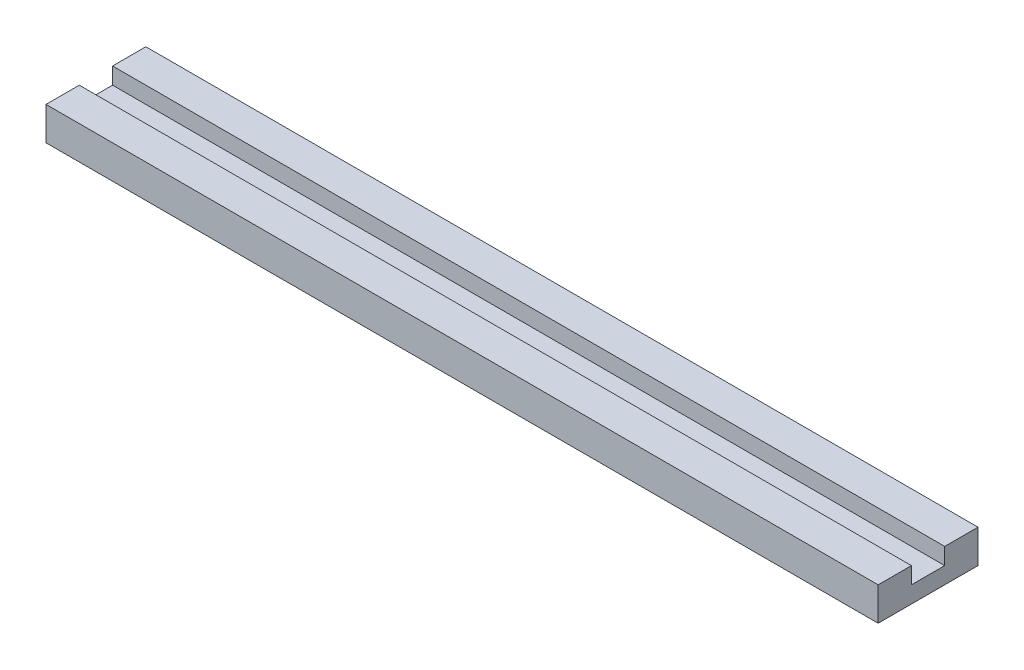
ISO-10303-21;
HEADER;
FILE_DESCRIPTION(('STEP AP214'),'2;1');
FILE_NAME('part.step','',(''),(''),'','','');
FILE_SCHEMA(('AUTOMOTIVE_DESIGN { 1 0 10303 214 1 1 1 1 }'));
ENDSEC;
DATA;
#1=APPLICATION_CONTEXT('core data for automotive mechanical design processes');
#2=APPLICATION_PROTOCOL_DEFINITION('international standard','automotive_design',2000,#1);
#3=PRODUCT_CONTEXT('',#1,'mechanical');
#4=PRODUCT('Part','Part','',(#3));
#5=PRODUCT_RELATED_PRODUCT_CATEGORY('part','',(#4));
#6=PRODUCT_DEFINITION_FORMATION('','',#4);
#7=PRODUCT_DEFINITION_CONTEXT('part definition',#1,'design');
#8=PRODUCT_DEFINITION('design','',#6,#7);
#9=PRODUCT_DEFINITION_SHAPE('','',#8);
#10=(LENGTH_UNIT() NAMED_UNIT(*) SI_UNIT(.MILLI.,.METRE.));
#11=(NAMED_UNIT(*) PLANE_ANGLE_UNIT() SI_UNIT($,.RADIAN.));
#12=(NAMED_UNIT(*) SI_UNIT($,.STERADIAN.) SOLID_ANGLE_UNIT());
#13=UNCERTAINTY_MEASURE_WITH_UNIT(LENGTH_MEASURE(1.E-05),#10,'distance_accuracy_value','');
#14=(GEOMETRIC_REPRESENTATION_CONTEXT(3) GLOBAL_UNCERTAINTY_ASSIGNED_CONTEXT((#13)) GLOBAL_UNIT_ASSIGNED_CONTEXT((#10,
#11,#12)) REPRESENTATION_CONTEXT('',''));
#15=CARTESIAN_POINT('',(0.,0.,0.));
#16=DIRECTION('',(0.,0.,1.));
#17=DIRECTION('',(1.,0.,0.));
#18=AXIS2_PLACEMENT_3D('',#15,#16,#17);
#19=CARTESIAN_POINT('',(50.,2.,2.));
#20=DIRECTION('',(0.,0.,1.));
#21=DIRECTION('',(1.,0.,0.));
#22=AXIS2_PLACEMENT_3D('',#19,#20,#21);
#23=PLANE('',#22);
#24=DIRECTION('',(0.,1.,0.));
#25=VECTOR('',#24,1.);
#26=CARTESIAN_POINT('',(-50.,2.,2.));
#27=LINE('',#26,#25);
#28=CARTESIAN_POINT('',(-50.,0.,2.));
#29=VERTEX_POINT('',#28);
#30=CARTESIAN_POINT('',(-50.,2.,2.));
#31=VERTEX_POINT('',#30);
#32=EDGE_CURVE('E133',#29,#31,#27,.T.);
#33=ORIENTED_EDGE('',*,*,#32,.T.);
#34=DIRECTION('',(-1.,0.,0.));
#35=VECTOR('',#34,1.);
#36=CARTESIAN_POINT('',(50.,2.,2.));
#37=LINE('',#36,#35);
#38=CARTESIAN_POINT('',(50.,2.,2.));
#39=VERTEX_POINT('',#38);
#40=EDGE_CURVE('E11',#39,#31,#37,.T.);
#41=ORIENTED_EDGE('',*,*,#40,.F.);
#42=DIRECTION('',(0.,1.,0.));
#43=VECTOR('',#42,1.);
#44=CARTESIAN_POINT('',(50.,2.,2.));
#45=LINE('',#44,#43);
#46=CARTESIAN_POINT('',(50.,0.,2.));
#47=VERTEX_POINT('',#46);
#48=EDGE_CURVE('E147',#47,#39,#45,.T.);
#49=ORIENTED_EDGE('',*,*,#48,.F.);
#50=DIRECTION('',(-1.,0.,0.));
#51=VECTOR('',#50,1.);
#52=CARTESIAN_POINT('',(50.,0.,2.));
#53=LINE('',#52,#51);
#54=EDGE_CURVE('E129',#47,#29,#53,.T.);
#55=ORIENTED_EDGE('',*,*,#54,.T.);
#56=EDGE_LOOP('',(#33,#41,#49,#55));
#57=FACE_BOUND('',#56,.T.);
#58=ADVANCED_FACE('F37',(#57),#23,.F.);
#59=CARTESIAN_POINT('',(50.,2.,2.));
#60=DIRECTION('',(0.,-1.,0.));
#61=DIRECTION('',(0.,0.,-1.));
#62=AXIS2_PLACEMENT_3D('',#59,#60,#61);
#63=PLANE('',#62);
#64=DIRECTION('',(0.,0.,1.));
#65=VECTOR('',#64,1.);
#66=CARTESIAN_POINT('',(-50.,2.,2.));
#67=LINE('',#66,#65);
#68=CARTESIAN_POINT('',(-50.,2.,6.));
#69=VERTEX_POINT('',#68);
#70=EDGE_CURVE('E136',#31,#69,#67,.T.);
#71=ORIENTED_EDGE('',*,*,#70,.T.);
#72=DIRECTION('',(-1.,0.,0.));
#73=VECTOR('',#72,1.);
#74=CARTESIAN_POINT('',(50.,2.,6.));
#75=LINE('',#74,#73);
#76=CARTESIAN_POINT('',(50.,2.,6.));
#77=VERTEX_POINT('',#76);
#78=EDGE_CURVE('E45',#77,#69,#75,.T.);
#79=ORIENTED_EDGE('',*,*,#78,.F.);
#80=DIRECTION('',(0.,0.,1.));
#81=VECTOR('',#80,1.);
#82=CARTESIAN_POINT('',(50.,2.,2.));
#83=LINE('',#82,#81);
#84=EDGE_CURVE('E96',#39,#77,#83,.T.);
#85=ORIENTED_EDGE('',*,*,#84,.F.);
#86=ORIENTED_EDGE('',*,*,#40,.T.);
#87=EDGE_LOOP('',(#71,#79,#85,#86));
#88=FACE_BOUND('',#87,.T.);
#89=ADVANCED_FACE('F182',(#88),#63,.F.);
#90=CARTESIAN_POINT('',(50.,2.,6.));
#91=DIRECTION('',(0.,0.,-1.));
#92=DIRECTION('',(-1.,0.,0.));
#93=AXIS2_PLACEMENT_3D('',#90,#91,#92);
#94=PLANE('',#93);
#95=DIRECTION('',(0.,-1.,0.));
#96=VECTOR('',#95,1.);
#97=CARTESIAN_POINT('',(-50.,2.,6.));
#98=LINE('',#97,#96);
#99=CARTESIAN_POINT('',(-50.,-2.,6.));
#100=VERTEX_POINT('',#99);
#101=EDGE_CURVE('E138',#69,#100,#98,.T.);
#102=ORIENTED_EDGE('',*,*,#101,.T.);
#103=DIRECTION('',(-1.,0.,0.));
#104=VECTOR('',#103,1.);
#105=CARTESIAN_POINT('',(50.,-2.,6.));
#106=LINE('',#105,#104);
#107=CARTESIAN_POINT('',(50.,-2.,6.));
#108=VERTEX_POINT('',#107);
#109=EDGE_CURVE('E154',#108,#100,#106,.T.);
#110=ORIENTED_EDGE('',*,*,#109,.F.);
#111=DIRECTION('',(0.,-1.,0.));
#112=VECTOR('',#111,1.);
#113=CARTESIAN_POINT('',(50.,2.,6.));
#114=LINE('',#113,#112);
#115=EDGE_CURVE('E162',#77,#108,#114,.T.);
#116=ORIENTED_EDGE('',*,*,#115,.F.);
#117=ORIENTED_EDGE('',*,*,#78,.T.);
#118=EDGE_LOOP('',(#102,#110,#116,#117));
#119=FACE_BOUND('',#118,.T.);
#120=ADVANCED_FACE('F160',(#119),#94,.F.);
#121=CARTESIAN_POINT('',(50.,-2.,6.));
#122=DIRECTION('',(0.,1.,0.));
#123=DIRECTION('',(0.,0.,1.));
#124=AXIS2_PLACEMENT_3D('',#121,#122,#123);
#125=PLANE('',#124);
#126=DIRECTION('',(0.,0.,-1.));
#127=VECTOR('',#126,1.);
#128=CARTESIAN_POINT('',(-50.,-2.,6.));
#129=LINE('',#128,#127);
#130=CARTESIAN_POINT('',(-50.,-2.,-6.));
#131=VERTEX_POINT('',#130);
#132=EDGE_CURVE('E140',#100,#131,#129,.T.);
#133=ORIENTED_EDGE('',*,*,#132,.T.);
#134=DIRECTION('',(-1.,0.,0.));
#135=VECTOR('',#134,1.);
#136=CARTESIAN_POINT('',(50.,-2.,-6.));
#137=LINE('',#136,#135);
#138=CARTESIAN_POINT('',(50.,-2.,-6.));
#139=VERTEX_POINT('',#138);
#140=EDGE_CURVE('E151',#139,#131,#137,.T.);
#141=ORIENTED_EDGE('',*,*,#140,.F.);
#142=DIRECTION('',(0.,0.,-1.));
#143=VECTOR('',#142,1.);
#144=CARTESIAN_POINT('',(50.,-2.,6.));
#145=LINE('',#144,#143);
#146=EDGE_CURVE('E174',#108,#139,#145,.T.);
#147=ORIENTED_EDGE('',*,*,#146,.F.);
#148=ORIENTED_EDGE('',*,*,#109,.T.);
#149=EDGE_LOOP('',(#133,#141,#147,#148));
#150=FACE_BOUND('',#149,.T.);
#151=ADVANCED_FACE('F170',(#150),#125,.F.);
#152=CARTESIAN_POINT('',(50.,2.,-6.));
#153=DIRECTION('',(0.,0.,1.));
#154=DIRECTION('',(1.,0.,0.));
#155=AXIS2_PLACEMENT_3D('',#152,#153,#154);
#156=PLANE('',#155);
#157=DIRECTION('',(0.,1.,0.));
#158=VECTOR('',#157,1.);
#159=CARTESIAN_POINT('',(-50.,2.,-6.));
#160=LINE('',#159,#158);
#161=CARTESIAN_POINT('',(-50.,2.,-6.));
#162=VERTEX_POINT('',#161);
#163=EDGE_CURVE('E142',#131,#162,#160,.T.);
#164=ORIENTED_EDGE('',*,*,#163,.T.);
#165=DIRECTION('',(-1.,0.,0.));
#166=VECTOR('',#165,1.);
#167=CARTESIAN_POINT('',(50.,2.,-6.));
#168=LINE('',#167,#166);
#169=CARTESIAN_POINT('',(50.,2.,-6.));
#170=VERTEX_POINT('',#169);
#171=EDGE_CURVE('E124',#170,#162,#168,.T.);
#172=ORIENTED_EDGE('',*,*,#171,.F.);
#173=DIRECTION('',(0.,1.,0.));
#174=VECTOR('',#173,1.);
#175=CARTESIAN_POINT('',(50.,2.,-6.));
#176=LINE('',#175,#174);
#177=EDGE_CURVE('E115',#139,#170,#176,.T.);
#178=ORIENTED_EDGE('',*,*,#177,.F.);
#179=ORIENTED_EDGE('',*,*,#140,.T.);
#180=EDGE_LOOP('',(#164,#172,#178,#179));
#181=FACE_BOUND('',#180,.T.);
#182=ADVANCED_FACE('F173',(#181),#156,.F.);
#183=CARTESIAN_POINT('',(50.,2.,-2.));
#184=DIRECTION('',(0.,-1.,0.));
#185=DIRECTION('',(0.,0.,-1.));
#186=AXIS2_PLACEMENT_3D('',#183,#184,#185);
#187=PLANE('',#186);
#188=DIRECTION('',(0.,0.,1.));
#189=VECTOR('',#188,1.);
#190=CARTESIAN_POINT('',(-50.,2.,-2.));
#191=LINE('',#190,#189);
#192=CARTESIAN_POINT('',(-50.,2.,-2.));
#193=VERTEX_POINT('',#192);
#194=EDGE_CURVE('E123',#162,#193,#191,.T.);
#195=ORIENTED_EDGE('',*,*,#194,.T.);
#196=DIRECTION('',(-1.,0.,0.));
#197=VECTOR('',#196,1.);
#198=CARTESIAN_POINT('',(50.,2.,-2.));
#199=LINE('',#198,#197);
#200=CARTESIAN_POINT('',(50.,2.,-2.));
#201=VERTEX_POINT('',#200);
#202=EDGE_CURVE('E120',#201,#193,#199,.T.);
#203=ORIENTED_EDGE('',*,*,#202,.F.);
#204=DIRECTION('',(0.,0.,1.));
#205=VECTOR('',#204,1.);
#206=CARTESIAN_POINT('',(50.,2.,-2.));
#207=LINE('',#206,#205);
#208=EDGE_CURVE('E109',#170,#201,#207,.T.);
#209=ORIENTED_EDGE('',*,*,#208,.F.);
#210=ORIENTED_EDGE('',*,*,#171,.T.);
#211=EDGE_LOOP('',(#195,#203,#209,#210));
#212=FACE_BOUND('',#211,.T.);
#213=ADVANCED_FACE('F121',(#212),#187,.F.);
#214=CARTESIAN_POINT('',(50.,2.,-2.));
#215=DIRECTION('',(0.,0.,-1.));
#216=DIRECTION('',(-1.,0.,0.));
#217=AXIS2_PLACEMENT_3D('',#214,#215,#216);
#218=PLANE('',#217);
#219=DIRECTION('',(0.,-1.,0.));
#220=VECTOR('',#219,1.);
#221=CARTESIAN_POINT('',(-50.,2.,-2.));
#222=LINE('',#221,#220);
#223=CARTESIAN_POINT('',(-50.,0.,-2.));
#224=VERTEX_POINT('',#223);
#225=EDGE_CURVE('E82',#193,#224,#222,.T.);
#226=ORIENTED_EDGE('',*,*,#225,.T.);
#227=DIRECTION('',(-1.,0.,0.));
#228=VECTOR('',#227,1.);
#229=CARTESIAN_POINT('',(50.,0.,-2.));
#230=LINE('',#229,#228);
#231=CARTESIAN_POINT('',(50.,0.,-2.));
#232=VERTEX_POINT('',#231);
#233=EDGE_CURVE('E125',#232,#224,#230,.T.);
#234=ORIENTED_EDGE('',*,*,#233,.F.);
#235=DIRECTION('',(0.,-1.,0.));
#236=VECTOR('',#235,1.);
#237=CARTESIAN_POINT('',(50.,2.,-2.));
#238=LINE('',#237,#236);
#239=EDGE_CURVE('E113',#201,#232,#238,.T.);
#240=ORIENTED_EDGE('',*,*,#239,.F.);
#241=ORIENTED_EDGE('',*,*,#202,.T.);
#242=EDGE_LOOP('',(#226,#234,#240,#241));
#243=FACE_BOUND('',#242,.T.);
#244=ADVANCED_FACE('F127',(#243),#218,.F.);
#245=CARTESIAN_POINT('',(50.,0.,2.));
#246=DIRECTION('',(0.,-1.,0.));
#247=DIRECTION('',(0.,0.,-1.));
#248=AXIS2_PLACEMENT_3D('',#245,#246,#247);
#249=PLANE('',#248);
#250=DIRECTION('',(0.,0.,1.));
#251=VECTOR('',#250,1.);
#252=CARTESIAN_POINT('',(-50.,0.,2.));
#253=LINE('',#252,#251);
#254=EDGE_CURVE('E88',#224,#29,#253,.T.);
#255=ORIENTED_EDGE('',*,*,#254,.T.);
#256=ORIENTED_EDGE('',*,*,#54,.F.);
#257=DIRECTION('',(0.,0.,1.));
#258=VECTOR('',#257,1.);
#259=CARTESIAN_POINT('',(50.,0.,2.));
#260=LINE('',#259,#258);
#261=EDGE_CURVE('E53',#232,#47,#260,.T.);
#262=ORIENTED_EDGE('',*,*,#261,.F.);
#263=ORIENTED_EDGE('',*,*,#233,.T.);
#264=EDGE_LOOP('',(#255,#256,#262,#263));
#265=FACE_BOUND('',#264,.T.);
#266=ADVANCED_FACE('F198',(#265),#249,.F.);
#267=CARTESIAN_POINT('',(50.,0.,0.));
#268=DIRECTION('',(1.,0.,0.));
#269=DIRECTION('',(0.,0.,-1.));
#270=AXIS2_PLACEMENT_3D('',#267,#268,#269);
#271=PLANE('',#270);
#272=ORIENTED_EDGE('',*,*,#48,.T.);
#273=ORIENTED_EDGE('',*,*,#84,.T.);
#274=ORIENTED_EDGE('',*,*,#115,.T.);
#275=ORIENTED_EDGE('',*,*,#146,.T.);
#276=ORIENTED_EDGE('',*,*,#177,.T.);
#277=ORIENTED_EDGE('',*,*,#208,.T.);
#278=ORIENTED_EDGE('',*,*,#239,.T.);
#279=ORIENTED_EDGE('',*,*,#261,.T.);
#280=EDGE_LOOP('',(#272,#273,#274,#275,#276,#277,#278,#279));
#281=FACE_BOUND('',#280,.T.);
#282=ADVANCED_FACE('F111',(#281),#271,.T.);
#283=CARTESIAN_POINT('',(-50.,0.,0.));
#284=DIRECTION('',(1.,0.,0.));
#285=DIRECTION('',(0.,0.,-1.));
#286=AXIS2_PLACEMENT_3D('',#283,#284,#285);
#287=PLANE('',#286);
#288=ORIENTED_EDGE('',*,*,#32,.F.);
#289=ORIENTED_EDGE('',*,*,#254,.F.);
#290=ORIENTED_EDGE('',*,*,#225,.F.);
#291=ORIENTED_EDGE('',*,*,#194,.F.);
#292=ORIENTED_EDGE('',*,*,#163,.F.);
#293=ORIENTED_EDGE('',*,*,#132,.F.);
#294=ORIENTED_EDGE('',*,*,#101,.F.);
#295=ORIENTED_EDGE('',*,*,#70,.F.);
#296=EDGE_LOOP('',(#288,#289,#290,#291,#292,#293,#294,#295));
#297=FACE_BOUND('',#296,.T.);
#298=ADVANCED_FACE('F166',(#297),#287,.F.);
#299=CLOSED_SHELL('',(#58,#89,#120,#151,#182,#213,#244,#266,#282,#298));
#300=MANIFOLD_SOLID_BREP('B2',#299);
#301=ADVANCED_BREP_SHAPE_REPRESENTATION('',(#18,#300),#14);
#302=SHAPE_DEFINITION_REPRESENTATION(#9,#301);
ENDSEC;
END-ISO-10303-21;
